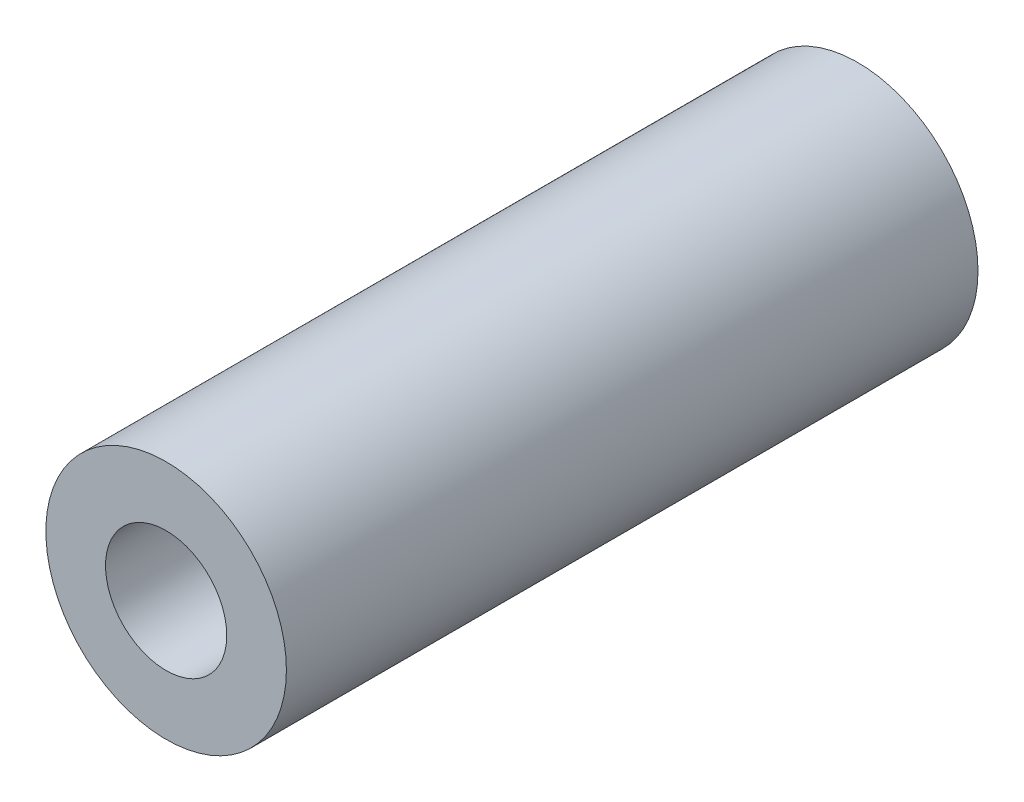
ISO-10303-21;
HEADER;
FILE_DESCRIPTION(('STEP AP214'),'2;1');
FILE_NAME('part.step','',(''),(''),'','','');
FILE_SCHEMA(('AUTOMOTIVE_DESIGN { 1 0 10303 214 1 1 1 1 }'));
ENDSEC;
DATA;
#1=APPLICATION_CONTEXT('core data for automotive mechanical design processes');
#2=APPLICATION_PROTOCOL_DEFINITION('international standard','automotive_design',2000,#1);
#3=PRODUCT_CONTEXT('',#1,'mechanical');
#4=PRODUCT('Part','Part','',(#3));
#5=PRODUCT_RELATED_PRODUCT_CATEGORY('part','',(#4));
#6=PRODUCT_DEFINITION_FORMATION('','',#4);
#7=PRODUCT_DEFINITION_CONTEXT('part definition',#1,'design');
#8=PRODUCT_DEFINITION('design','',#6,#7);
#9=PRODUCT_DEFINITION_SHAPE('','',#8);
#10=(LENGTH_UNIT() NAMED_UNIT(*) SI_UNIT(.MILLI.,.METRE.));
#11=(NAMED_UNIT(*) PLANE_ANGLE_UNIT() SI_UNIT($,.RADIAN.));
#12=(NAMED_UNIT(*) SI_UNIT($,.STERADIAN.) SOLID_ANGLE_UNIT());
#13=UNCERTAINTY_MEASURE_WITH_UNIT(LENGTH_MEASURE(1.E-05),#10,'distance_accuracy_value','');
#14=(GEOMETRIC_REPRESENTATION_CONTEXT(3) GLOBAL_UNCERTAINTY_ASSIGNED_CONTEXT((#13)) GLOBAL_UNIT_ASSIGNED_CONTEXT((#10,
#11,#12)) REPRESENTATION_CONTEXT('',''));
#15=CARTESIAN_POINT('',(0.,0.,0.));
#16=DIRECTION('',(0.,0.,1.));
#17=DIRECTION('',(1.,0.,0.));
#18=AXIS2_PLACEMENT_3D('',#15,#16,#17);
#19=CARTESIAN_POINT('',(0.,0.,18.2562500000001));
#20=DIRECTION('',(0.,0.,1.));
#21=DIRECTION('',(1.,0.,0.));
#22=AXIS2_PLACEMENT_3D('',#19,#20,#21);
#23=PLANE('',#22);
#24=CARTESIAN_POINT('',(0.,0.,18.2562500000001));
#25=DIRECTION('',(0.,0.,1.));
#26=DIRECTION('',(1.,0.,0.));
#27=AXIS2_PLACEMENT_3D('',#24,#25,#26);
#28=CIRCLE('',#27,6.35);
#29=CARTESIAN_POINT('',(6.35000000000002,0.,18.2562500000001));
#30=VERTEX_POINT('',#29);
#31=EDGE_CURVE('E10',#30,#30,#28,.T.);
#32=ORIENTED_EDGE('',*,*,#31,.T.);
#33=EDGE_LOOP('',(#32));
#34=FACE_BOUND('',#33,.T.);
#35=CARTESIAN_POINT('',(0.,0.,18.2562500000001));
#36=DIRECTION('',(0.,0.,1.));
#37=DIRECTION('',(1.,0.,0.));
#38=AXIS2_PLACEMENT_3D('',#35,#36,#37);
#39=CIRCLE('',#38,3.2004);
#40=CARTESIAN_POINT('',(3.20040000000001,0.,18.2562500000001));
#41=VERTEX_POINT('',#40);
#42=EDGE_CURVE('E35',#41,#41,#39,.T.);
#43=ORIENTED_EDGE('',*,*,#42,.F.);
#44=EDGE_LOOP('',(#43));
#45=FACE_BOUND('',#44,.T.);
#46=ADVANCED_FACE('F28',(#34,#45),#23,.T.);
#47=CARTESIAN_POINT('',(0.,0.,18.2562500000001));
#48=DIRECTION('',(0.,0.,-1.));
#49=DIRECTION('',(-1.,0.,0.));
#50=AXIS2_PLACEMENT_3D('',#47,#48,#49);
#51=CYLINDRICAL_SURFACE('',#50,6.35);
#52=ORIENTED_EDGE('',*,*,#31,.F.);
#53=EDGE_LOOP('',(#52));
#54=FACE_BOUND('',#53,.T.);
#55=CARTESIAN_POINT('',(0.,0.,-18.2562500000001));
#56=DIRECTION('',(0.,0.,1.));
#57=DIRECTION('',(1.,0.,0.));
#58=AXIS2_PLACEMENT_3D('',#55,#56,#57);
#59=CIRCLE('',#58,6.35);
#60=CARTESIAN_POINT('',(6.35000000000002,0.,-18.2562500000001));
#61=VERTEX_POINT('',#60);
#62=EDGE_CURVE('E39',#61,#61,#59,.T.);
#63=ORIENTED_EDGE('',*,*,#62,.T.);
#64=EDGE_LOOP('',(#63));
#65=FACE_BOUND('',#64,.T.);
#66=ADVANCED_FACE('F30',(#54,#65),#51,.T.);
#67=CARTESIAN_POINT('',(0.,0.,18.2562500000001));
#68=DIRECTION('',(0.,0.,-1.));
#69=DIRECTION('',(-1.,0.,0.));
#70=AXIS2_PLACEMENT_3D('',#67,#68,#69);
#71=CYLINDRICAL_SURFACE('',#70,3.2004);
#72=ORIENTED_EDGE('',*,*,#42,.T.);
#73=EDGE_LOOP('',(#72));
#74=FACE_BOUND('',#73,.T.);
#75=CARTESIAN_POINT('',(0.,0.,-18.2562500000001));
#76=DIRECTION('',(0.,0.,1.));
#77=DIRECTION('',(1.,0.,0.));
#78=AXIS2_PLACEMENT_3D('',#75,#76,#77);
#79=CIRCLE('',#78,3.2004);
#80=CARTESIAN_POINT('',(3.20040000000001,0.,-18.2562500000001));
#81=VERTEX_POINT('',#80);
#82=EDGE_CURVE('E43',#81,#81,#79,.T.);
#83=ORIENTED_EDGE('',*,*,#82,.F.);
#84=EDGE_LOOP('',(#83));
#85=FACE_BOUND('',#84,.T.);
#86=ADVANCED_FACE('F52',(#74,#85),#71,.F.);
#87=CARTESIAN_POINT('',(0.,0.,-18.2562500000001));
#88=DIRECTION('',(0.,0.,1.));
#89=DIRECTION('',(1.,0.,0.));
#90=AXIS2_PLACEMENT_3D('',#87,#88,#89);
#91=PLANE('',#90);
#92=ORIENTED_EDGE('',*,*,#82,.T.);
#93=EDGE_LOOP('',(#92));
#94=FACE_BOUND('',#93,.T.);
#95=ORIENTED_EDGE('',*,*,#62,.F.);
#96=EDGE_LOOP('',(#95));
#97=FACE_BOUND('',#96,.T.);
#98=ADVANCED_FACE('F49',(#94,#97),#91,.F.);
#99=CLOSED_SHELL('',(#46,#66,#86,#98));
#100=MANIFOLD_SOLID_BREP('B2',#99);
#101=ADVANCED_BREP_SHAPE_REPRESENTATION('',(#18,#100),#14);
#102=SHAPE_DEFINITION_REPRESENTATION(#9,#101);
ENDSEC;
END-ISO-10303-21;
